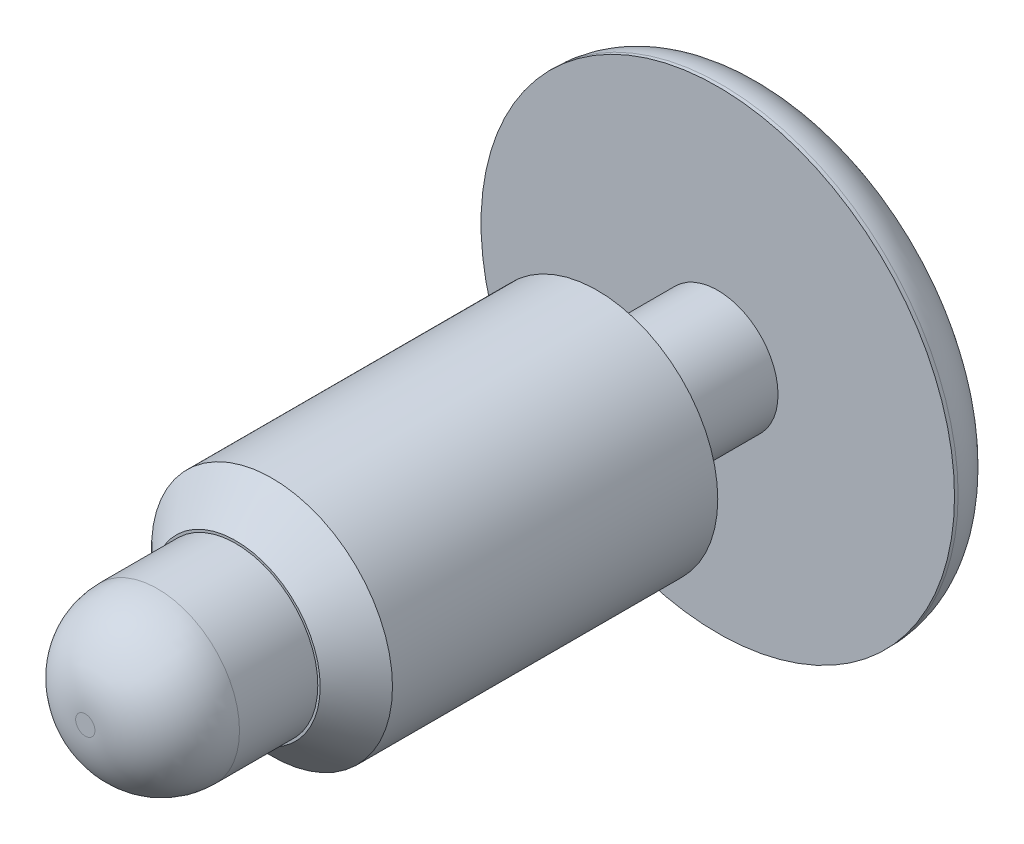
ISO-10303-21;
HEADER;
FILE_DESCRIPTION(('STEP AP214'),'2;1');
FILE_NAME('part.step','',(''),(''),'','','');
FILE_SCHEMA(('AUTOMOTIVE_DESIGN { 1 0 10303 214 1 1 1 1 }'));
ENDSEC;
DATA;
#1=APPLICATION_CONTEXT('core data for automotive mechanical design processes');
#2=APPLICATION_PROTOCOL_DEFINITION('international standard','automotive_design',2000,#1);
#3=PRODUCT_CONTEXT('',#1,'mechanical');
#4=PRODUCT('Part','Part','',(#3));
#5=PRODUCT_RELATED_PRODUCT_CATEGORY('part','',(#4));
#6=PRODUCT_DEFINITION_FORMATION('','',#4);
#7=PRODUCT_DEFINITION_CONTEXT('part definition',#1,'design');
#8=PRODUCT_DEFINITION('design','',#6,#7);
#9=PRODUCT_DEFINITION_SHAPE('','',#8);
#10=(LENGTH_UNIT() NAMED_UNIT(*) SI_UNIT(.MILLI.,.METRE.));
#11=(NAMED_UNIT(*) PLANE_ANGLE_UNIT() SI_UNIT($,.RADIAN.));
#12=(NAMED_UNIT(*) SI_UNIT($,.STERADIAN.) SOLID_ANGLE_UNIT());
#13=UNCERTAINTY_MEASURE_WITH_UNIT(LENGTH_MEASURE(1.E-05),#10,'distance_accuracy_value','');
#14=(GEOMETRIC_REPRESENTATION_CONTEXT(3) GLOBAL_UNCERTAINTY_ASSIGNED_CONTEXT((#13)) GLOBAL_UNIT_ASSIGNED_CONTEXT((#10,
#11,#12)) REPRESENTATION_CONTEXT('',''));
#15=CARTESIAN_POINT('',(0.,0.,0.));
#16=DIRECTION('',(0.,0.,1.));
#17=DIRECTION('',(1.,0.,0.));
#18=AXIS2_PLACEMENT_3D('',#15,#16,#17);
#19=CARTESIAN_POINT('',(0.,0.,11.2522));
#20=DIRECTION('',(0.,0.,1.));
#21=DIRECTION('',(1.,0.,0.));
#22=AXIS2_PLACEMENT_3D('',#19,#20,#21);
#23=PLANE('',#22);
#24=CARTESIAN_POINT('',(0.,0.,11.2522));
#25=DIRECTION('',(0.,0.,1.));
#26=DIRECTION('',(1.,0.,0.));
#27=AXIS2_PLACEMENT_3D('',#24,#25,#26);
#28=CIRCLE('',#27,1.778);
#29=CARTESIAN_POINT('',(1.778,0.,11.2522));
#30=VERTEX_POINT('',#29);
#31=EDGE_CURVE('E45',#30,#30,#28,.T.);
#32=ORIENTED_EDGE('',*,*,#31,.T.);
#33=EDGE_LOOP('',(#32));
#34=FACE_BOUND('',#33,.T.);
#35=CARTESIAN_POINT('',(0.,0.,11.2522));
#36=DIRECTION('',(0.,0.,1.));
#37=DIRECTION('',(1.,0.,0.));
#38=AXIS2_PLACEMENT_3D('',#35,#36,#37);
#39=CIRCLE('',#38,1.7272);
#40=CARTESIAN_POINT('',(1.7272,0.,11.2522));
#41=VERTEX_POINT('',#40);
#42=EDGE_CURVE('E68',#41,#41,#39,.T.);
#43=ORIENTED_EDGE('',*,*,#42,.F.);
#44=EDGE_LOOP('',(#43));
#45=FACE_BOUND('',#44,.T.);
#46=ADVANCED_FACE('F30',(#34,#45),#23,.T.);
#47=CARTESIAN_POINT('',(0.,0.,11.2522));
#48=DIRECTION('',(0.,0.,-1.));
#49=DIRECTION('',(-1.,0.,0.));
#50=AXIS2_PLACEMENT_3D('',#47,#48,#49);
#51=CYLINDRICAL_SURFACE('',#50,1.27);
#52=CARTESIAN_POINT('',(0.,0.,1.0922));
#53=DIRECTION('',(0.,0.,1.));
#54=DIRECTION('',(1.,0.,0.));
#55=AXIS2_PLACEMENT_3D('',#52,#53,#54);
#56=CIRCLE('',#55,1.27);
#57=CARTESIAN_POINT('',(1.27,0.,1.0922));
#58=VERTEX_POINT('',#57);
#59=EDGE_CURVE('E62',#58,#58,#56,.T.);
#60=ORIENTED_EDGE('',*,*,#59,.T.);
#61=EDGE_LOOP('',(#60));
#62=FACE_BOUND('',#61,.T.);
#63=CARTESIAN_POINT('',(0.,0.,3.6322));
#64=DIRECTION('',(0.,0.,1.));
#65=DIRECTION('',(1.,0.,0.));
#66=AXIS2_PLACEMENT_3D('',#63,#64,#65);
#67=CIRCLE('',#66,1.27);
#68=CARTESIAN_POINT('',(1.27,0.,3.6322));
#69=VERTEX_POINT('',#68);
#70=EDGE_CURVE('E56',#69,#69,#67,.T.);
#71=ORIENTED_EDGE('',*,*,#70,.F.);
#72=EDGE_LOOP('',(#71));
#73=FACE_BOUND('',#72,.T.);
#74=ADVANCED_FACE('F75',(#62,#73),#51,.T.);
#75=CARTESIAN_POINT('',(0.,0.,1.0922));
#76=DIRECTION('',(0.,0.,1.));
#77=DIRECTION('',(1.,0.,0.));
#78=AXIS2_PLACEMENT_3D('',#75,#76,#77);
#79=PLANE('',#78);
#80=CARTESIAN_POINT('',(0.,0.,1.0922));
#81=DIRECTION('',(0.,0.,1.));
#82=DIRECTION('',(1.,0.,0.));
#83=AXIS2_PLACEMENT_3D('',#80,#81,#82);
#84=CIRCLE('',#83,4.9911);
#85=CARTESIAN_POINT('',(4.9911,0.,1.0922));
#86=VERTEX_POINT('',#85);
#87=EDGE_CURVE('E59',#86,#86,#84,.T.);
#88=ORIENTED_EDGE('',*,*,#87,.T.);
#89=EDGE_LOOP('',(#88));
#90=FACE_BOUND('',#89,.T.);
#91=ORIENTED_EDGE('',*,*,#59,.F.);
#92=EDGE_LOOP('',(#91));
#93=FACE_BOUND('',#92,.T.);
#94=ADVANCED_FACE('F81',(#90,#93),#79,.T.);
#95=CARTESIAN_POINT('',(0.,0.,1.0922));
#96=DIRECTION('',(0.,0.,-1.));
#97=DIRECTION('',(-1.,0.,0.));
#98=AXIS2_PLACEMENT_3D('',#95,#96,#97);
#99=CYLINDRICAL_SURFACE('',#98,4.9911);
#100=CARTESIAN_POINT('',(0.,0.,1.016));
#101=DIRECTION('',(0.,0.,1.));
#102=DIRECTION('',(1.,0.,0.));
#103=AXIS2_PLACEMENT_3D('',#100,#101,#102);
#104=CIRCLE('',#103,4.9911);
#105=CARTESIAN_POINT('',(4.9911,0.,1.016));
#106=VERTEX_POINT('',#105);
#107=EDGE_CURVE('E37',#106,#106,#104,.T.);
#108=ORIENTED_EDGE('',*,*,#107,.T.);
#109=EDGE_LOOP('',(#108));
#110=FACE_BOUND('',#109,.T.);
#111=ORIENTED_EDGE('',*,*,#87,.F.);
#112=EDGE_LOOP('',(#111));
#113=FACE_BOUND('',#112,.T.);
#114=ADVANCED_FACE('F32',(#110,#113),#99,.T.);
#115=CARTESIAN_POINT('',(0.,0.,0.));
#116=DIRECTION('',(0.,0.,1.));
#117=DIRECTION('',(1.,0.,0.));
#118=AXIS2_PLACEMENT_3D('',#115,#116,#117);
#119=PLANE('',#118);
#120=CARTESIAN_POINT('',(0.,0.,0.));
#121=DIRECTION('',(0.,0.,1.));
#122=DIRECTION('',(1.,0.,0.));
#123=AXIS2_PLACEMENT_3D('',#120,#121,#122);
#124=CIRCLE('',#123,3.9751);
#125=CARTESIAN_POINT('',(3.9751,0.,0.));
#126=VERTEX_POINT('',#125);
#127=EDGE_CURVE('E10',#126,#126,#124,.F.);
#128=ORIENTED_EDGE('',*,*,#127,.T.);
#129=EDGE_LOOP('',(#128));
#130=FACE_BOUND('',#129,.T.);
#131=ADVANCED_FACE('F88',(#130),#119,.F.);
#132=CARTESIAN_POINT('',(0.,0.,3.6322));
#133=DIRECTION('',(0.,0.,1.));
#134=DIRECTION('',(1.,0.,0.));
#135=AXIS2_PLACEMENT_3D('',#132,#133,#134);
#136=PLANE('',#135);
#137=CARTESIAN_POINT('',(0.,0.,3.6322));
#138=DIRECTION('',(0.,0.,1.));
#139=DIRECTION('',(1.,0.,0.));
#140=AXIS2_PLACEMENT_3D('',#137,#138,#139);
#141=CIRCLE('',#140,2.54);
#142=CARTESIAN_POINT('',(2.54,0.,3.6322));
#143=VERTEX_POINT('',#142);
#144=EDGE_CURVE('E65',#143,#143,#141,.T.);
#145=ORIENTED_EDGE('',*,*,#144,.F.);
#146=EDGE_LOOP('',(#145));
#147=FACE_BOUND('',#146,.T.);
#148=ORIENTED_EDGE('',*,*,#70,.T.);
#149=EDGE_LOOP('',(#148));
#150=FACE_BOUND('',#149,.T.);
#151=ADVANCED_FACE('F90',(#147,#150),#136,.F.);
#152=CARTESIAN_POINT('',(0.,0.,3.6322));
#153=DIRECTION('',(0.,0.,1.));
#154=DIRECTION('',(1.,0.,0.));
#155=AXIS2_PLACEMENT_3D('',#152,#153,#154);
#156=CYLINDRICAL_SURFACE('',#155,2.54);
#157=CARTESIAN_POINT('',(0.,0.,10.4902));
#158=DIRECTION('',(0.,0.,1.));
#159=DIRECTION('',(1.,0.,0.));
#160=AXIS2_PLACEMENT_3D('',#157,#158,#159);
#161=CIRCLE('',#160,2.54);
#162=CARTESIAN_POINT('',(2.54,0.,10.4902));
#163=VERTEX_POINT('',#162);
#164=EDGE_CURVE('E41',#163,#163,#161,.F.);
#165=CARTESIAN_POINT('',(2.54,0.,10.4902));
#166=CARTESIAN_POINT('',(2.54,0.,10.4187625));
#167=CARTESIAN_POINT('',(2.54,0.,10.347325));
#168=CARTESIAN_POINT('',(2.54,0.,10.20445));
#169=CARTESIAN_POINT('',(2.54,0.,10.1330125));
#170=CARTESIAN_POINT('',(2.54,0.,9.9901375));
#171=CARTESIAN_POINT('',(2.54,0.,9.9187));
#172=CARTESIAN_POINT('',(2.54,0.,9.775825));
#173=CARTESIAN_POINT('',(2.54,0.,9.7043875));
#174=CARTESIAN_POINT('',(2.54,0.,9.5615125));
#175=CARTESIAN_POINT('',(2.54,0.,9.490075));
#176=CARTESIAN_POINT('',(2.54,0.,9.3472));
#177=CARTESIAN_POINT('',(2.54,0.,9.2757625));
#178=CARTESIAN_POINT('',(2.54,0.,9.1328875));
#179=CARTESIAN_POINT('',(2.54,0.,9.06145));
#180=CARTESIAN_POINT('',(2.54,0.,8.918575));
#181=CARTESIAN_POINT('',(2.54,0.,8.8471375));
#182=CARTESIAN_POINT('',(2.54,0.,8.7042625));
#183=CARTESIAN_POINT('',(2.54,0.,8.632825));
#184=CARTESIAN_POINT('',(2.54,0.,8.48995));
#185=CARTESIAN_POINT('',(2.54,0.,8.4185125));
#186=CARTESIAN_POINT('',(2.54,0.,8.2756375));
#187=CARTESIAN_POINT('',(2.54,0.,8.2042));
#188=CARTESIAN_POINT('',(2.54,0.,8.061325));
#189=CARTESIAN_POINT('',(2.54,0.,7.9898875));
#190=CARTESIAN_POINT('',(2.54,0.,7.8470125));
#191=CARTESIAN_POINT('',(2.54,0.,7.775575));
#192=CARTESIAN_POINT('',(2.54,0.,7.6327));
#193=CARTESIAN_POINT('',(2.54,0.,7.5612625));
#194=CARTESIAN_POINT('',(2.54,0.,7.4183875));
#195=CARTESIAN_POINT('',(2.54,0.,7.34695));
#196=CARTESIAN_POINT('',(2.54,0.,7.204075));
#197=CARTESIAN_POINT('',(2.54,0.,7.1326375));
#198=CARTESIAN_POINT('',(2.54,0.,6.9897625));
#199=CARTESIAN_POINT('',(2.54,0.,6.918325));
#200=CARTESIAN_POINT('',(2.54,0.,6.77545));
#201=CARTESIAN_POINT('',(2.54,0.,6.7040125));
#202=CARTESIAN_POINT('',(2.54,0.,6.5611375));
#203=CARTESIAN_POINT('',(2.54,0.,6.4897));
#204=CARTESIAN_POINT('',(2.54,0.,6.346825));
#205=CARTESIAN_POINT('',(2.54,0.,6.2753875));
#206=CARTESIAN_POINT('',(2.54,0.,6.1325125));
#207=CARTESIAN_POINT('',(2.54,0.,6.061075));
#208=CARTESIAN_POINT('',(2.54,0.,5.9182));
#209=CARTESIAN_POINT('',(2.54,0.,5.8467625));
#210=CARTESIAN_POINT('',(2.54,0.,5.7038875));
#211=CARTESIAN_POINT('',(2.54,0.,5.63245));
#212=CARTESIAN_POINT('',(2.54,0.,5.489575));
#213=CARTESIAN_POINT('',(2.54,0.,5.4181375));
#214=CARTESIAN_POINT('',(2.54,0.,5.2752625));
#215=CARTESIAN_POINT('',(2.54,0.,5.203825));
#216=CARTESIAN_POINT('',(2.54,0.,5.06095));
#217=CARTESIAN_POINT('',(2.54,0.,4.9895125));
#218=CARTESIAN_POINT('',(2.54,0.,4.8466375));
#219=CARTESIAN_POINT('',(2.54,0.,4.7752));
#220=CARTESIAN_POINT('',(2.54,0.,4.632325));
#221=CARTESIAN_POINT('',(2.54,0.,4.5608875));
#222=CARTESIAN_POINT('',(2.54,0.,4.4180125));
#223=CARTESIAN_POINT('',(2.54,0.,4.346575));
#224=CARTESIAN_POINT('',(2.54,0.,4.2037));
#225=CARTESIAN_POINT('',(2.54,0.,4.1322625));
#226=CARTESIAN_POINT('',(2.54,0.,3.9893875));
#227=CARTESIAN_POINT('',(2.54,0.,3.91795));
#228=CARTESIAN_POINT('',(2.54,0.,3.775075));
#229=CARTESIAN_POINT('',(2.54,0.,3.7036375));
#230=CARTESIAN_POINT('',(2.54,0.,3.6322));
#231=B_SPLINE_CURVE_WITH_KNOTS('',3,(#165,#166,#167,#168,#169,#170,#171,#172,#173,#174,#175,
#176,#177,#178,#179,#180,#181,#182,#183,#184,#185,#186,#187,#188,#189,#190,#191,#192,#193,#194,
#195,#196,#197,#198,#199,#200,#201,#202,#203,#204,#205,#206,#207,#208,#209,#210,#211,#212,#213,
#214,#215,#216,#217,#218,#219,#220,#221,#222,#223,#224,#225,#226,#227,#228,#229,#230),
.UNSPECIFIED.,.F.,.F.,(4,2,2,2,2,2,2,2,2,2,2,2,2,2,2,2,2,2,2,2,2,2,2,2,2,2,2,2,2,2,2,2,4),(0.,
0.214312499999999,0.428625,0.642937499999999,0.857249999999999,1.0715625,1.285875,1.5001875,
1.7145,1.9288125,2.143125,2.3574375,2.57175,2.7860625,3.000375,3.2146875,3.429,3.6433125,
3.857625,4.0719375,4.28625,4.5005625,4.714875,4.9291875,5.1435,5.3578125,5.572125,5.7864375,
6.00075,6.2150625,6.42937499999999,6.6436875,6.858),.UNSPECIFIED.);
#232=EDGE_CURVE('BSEAM85',#163,#143,#231,.T.);
#233=ORIENTED_EDGE('',*,*,#164,.T.);
#234=ORIENTED_EDGE('',*,*,#144,.T.);
#235=ORIENTED_EDGE('',*,*,#232,.T.);
#236=ORIENTED_EDGE('',*,*,#232,.F.);
#237=EDGE_LOOP('',(#233,#235,#234,#236));
#238=FACE_BOUND('',#237,.T.);
#239=ADVANCED_FACE('F85',(#238),#156,.T.);
#240=CARTESIAN_POINT('',(0.,0.,14.4272));
#241=DIRECTION('',(0.,0.,-1.));
#242=DIRECTION('',(-1.,0.,0.));
#243=AXIS2_PLACEMENT_3D('',#240,#241,#242);
#244=CYLINDRICAL_SURFACE('',#243,1.7272);
#245=CARTESIAN_POINT('',(0.,0.,12.9032));
#246=DIRECTION('',(0.,0.,1.));
#247=DIRECTION('',(1.,0.,0.));
#248=AXIS2_PLACEMENT_3D('',#245,#246,#247);
#249=CIRCLE('',#248,1.7272);
#250=CARTESIAN_POINT('',(1.7272,0.,12.9032));
#251=VERTEX_POINT('',#250);
#252=EDGE_CURVE('E50',#251,#251,#249,.F.);
#253=ORIENTED_EDGE('',*,*,#252,.T.);
#254=EDGE_LOOP('',(#253));
#255=FACE_BOUND('',#254,.T.);
#256=ORIENTED_EDGE('',*,*,#42,.T.);
#257=EDGE_LOOP('',(#256));
#258=FACE_BOUND('',#257,.T.);
#259=ADVANCED_FACE('F72',(#255,#258),#244,.T.);
#260=CARTESIAN_POINT('',(0.,0.,14.4272));
#261=DIRECTION('',(0.,0.,1.));
#262=DIRECTION('',(1.,0.,0.));
#263=AXIS2_PLACEMENT_3D('',#260,#261,#262);
#264=PLANE('',#263);
#265=CARTESIAN_POINT('',(0.,0.,14.4272));
#266=DIRECTION('',(0.,0.,1.));
#267=DIRECTION('',(1.,0.,0.));
#268=AXIS2_PLACEMENT_3D('',#265,#266,#267);
#269=CIRCLE('',#268,0.2032);
#270=CARTESIAN_POINT('',(0.2032,0.,14.4272));
#271=VERTEX_POINT('',#270);
#272=EDGE_CURVE('E53',#271,#271,#269,.T.);
#273=ORIENTED_EDGE('',*,*,#272,.T.);
#274=EDGE_LOOP('',(#273));
#275=FACE_BOUND('',#274,.T.);
#276=ADVANCED_FACE('F112',(#275),#264,.T.);
#277=CARTESIAN_POINT('',(0.,0.,12.9032));
#278=DIRECTION('',(0.,0.,1.));
#279=DIRECTION('',(1.,0.,0.));
#280=AXIS2_PLACEMENT_3D('',#277,#278,#279);
#281=DEGENERATE_TOROIDAL_SURFACE('',#280,0.2032,1.524,.T.);
#282=ORIENTED_EDGE('',*,*,#252,.F.);
#283=EDGE_LOOP('',(#282));
#284=FACE_BOUND('',#283,.T.);
#285=ORIENTED_EDGE('',*,*,#272,.F.);
#286=EDGE_LOOP('',(#285));
#287=FACE_BOUND('',#286,.T.);
#288=ADVANCED_FACE('F116',(#284,#287),#281,.T.);
#289=CARTESIAN_POINT('',(0.,0.,11.2522));
#290=DIRECTION('',(0.,0.,-1.));
#291=DIRECTION('',(-1.,0.,0.));
#292=AXIS2_PLACEMENT_3D('',#289,#290,#291);
#293=CONICAL_SURFACE('',#292,1.778,0.785398163397447);
#294=ORIENTED_EDGE('',*,*,#164,.F.);
#295=EDGE_LOOP('',(#294));
#296=FACE_BOUND('',#295,.T.);
#297=ORIENTED_EDGE('',*,*,#31,.F.);
#298=EDGE_LOOP('',(#297));
#299=FACE_BOUND('',#298,.T.);
#300=ADVANCED_FACE('F120',(#296,#299),#293,.T.);
#301=CARTESIAN_POINT('',(0.,0.,1.016));
#302=DIRECTION('',(0.,0.,1.));
#303=DIRECTION('',(1.,0.,0.));
#304=AXIS2_PLACEMENT_3D('',#301,#302,#303);
#305=TOROIDAL_SURFACE('',#304,3.9751,1.016);
#306=ORIENTED_EDGE('',*,*,#127,.F.);
#307=EDGE_LOOP('',(#306));
#308=FACE_BOUND('',#307,.T.);
#309=ORIENTED_EDGE('',*,*,#107,.F.);
#310=EDGE_LOOP('',(#309));
#311=FACE_BOUND('',#310,.T.);
#312=ADVANCED_FACE('F124',(#308,#311),#305,.T.);
#313=CLOSED_SHELL('',(#46,#74,#94,#114,#131,#151,#239,#259,#276,#288,#300,#312));
#314=MANIFOLD_SOLID_BREP('B2',#313);
#315=ADVANCED_BREP_SHAPE_REPRESENTATION('',(#18,#314),#14);
#316=SHAPE_DEFINITION_REPRESENTATION(#9,#315);
ENDSEC;
END-ISO-10303-21;
